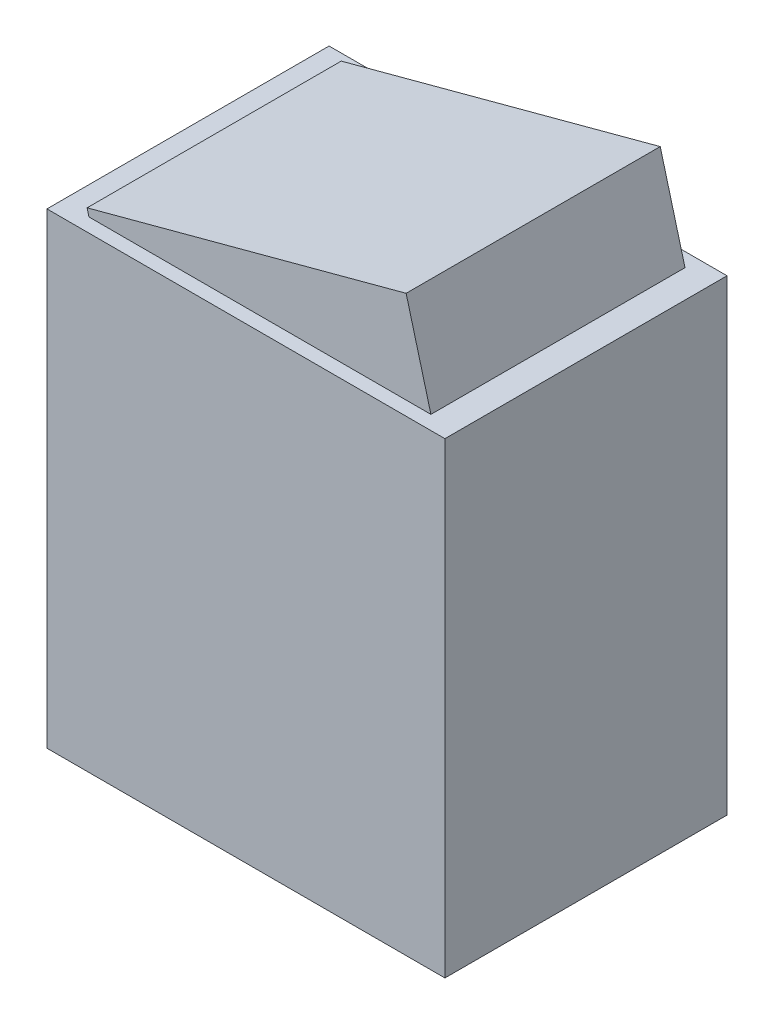
ISO-10303-21;
HEADER;
FILE_DESCRIPTION(('STEP AP214'),'2;1');
FILE_NAME('part.step','',(''),(''),'','','');
FILE_SCHEMA(('AUTOMOTIVE_DESIGN { 1 0 10303 214 1 1 1 1 }'));
ENDSEC;
DATA;
#1=APPLICATION_CONTEXT('core data for automotive mechanical design processes');
#2=APPLICATION_PROTOCOL_DEFINITION('international standard','automotive_design',2000,#1);
#3=PRODUCT_CONTEXT('',#1,'mechanical');
#4=PRODUCT('Part','Part','',(#3));
#5=PRODUCT_RELATED_PRODUCT_CATEGORY('part','',(#4));
#6=PRODUCT_DEFINITION_FORMATION('','',#4);
#7=PRODUCT_DEFINITION_CONTEXT('part definition',#1,'design');
#8=PRODUCT_DEFINITION('design','',#6,#7);
#9=PRODUCT_DEFINITION_SHAPE('','',#8);
#10=(LENGTH_UNIT() NAMED_UNIT(*) SI_UNIT(.MILLI.,.METRE.));
#11=(NAMED_UNIT(*) PLANE_ANGLE_UNIT() SI_UNIT($,.RADIAN.));
#12=(NAMED_UNIT(*) SI_UNIT($,.STERADIAN.) SOLID_ANGLE_UNIT());
#13=UNCERTAINTY_MEASURE_WITH_UNIT(LENGTH_MEASURE(1.E-05),#10,'distance_accuracy_value','');
#14=(GEOMETRIC_REPRESENTATION_CONTEXT(3) GLOBAL_UNCERTAINTY_ASSIGNED_CONTEXT((#13)) GLOBAL_UNIT_ASSIGNED_CONTEXT((#10,
#11,#12)) REPRESENTATION_CONTEXT('',''));
#15=CARTESIAN_POINT('',(0.,0.,0.));
#16=DIRECTION('',(0.,0.,1.));
#17=DIRECTION('',(1.,0.,0.));
#18=AXIS2_PLACEMENT_3D('',#15,#16,#17);
#19=CARTESIAN_POINT('',(0.,25.,0.));
#20=DIRECTION('',(0.,1.,0.));
#21=DIRECTION('',(0.,0.,1.));
#22=AXIS2_PLACEMENT_3D('',#19,#20,#21);
#23=PLANE('',#22);
#24=DIRECTION('',(0.,0.,-1.));
#25=VECTOR('',#24,1.);
#26=CARTESIAN_POINT('',(10.65,25.,-7.55));
#27=LINE('',#26,#25);
#28=CARTESIAN_POINT('',(10.65,25.,7.55));
#29=VERTEX_POINT('',#28);
#30=CARTESIAN_POINT('',(10.65,25.,-7.55));
#31=VERTEX_POINT('',#30);
#32=EDGE_CURVE('E143',#29,#31,#27,.T.);
#33=ORIENTED_EDGE('',*,*,#32,.T.);
#34=DIRECTION('',(-1.,0.,0.));
#35=VECTOR('',#34,1.);
#36=CARTESIAN_POINT('',(-10.65,25.,-7.55));
#37=LINE('',#36,#35);
#38=CARTESIAN_POINT('',(-10.65,25.,-7.55));
#39=VERTEX_POINT('',#38);
#40=EDGE_CURVE('E85',#31,#39,#37,.T.);
#41=ORIENTED_EDGE('',*,*,#40,.T.);
#42=DIRECTION('',(0.,0.,1.));
#43=VECTOR('',#42,1.);
#44=CARTESIAN_POINT('',(-10.65,25.,-7.55));
#45=LINE('',#44,#43);
#46=CARTESIAN_POINT('',(-10.65,25.,7.55));
#47=VERTEX_POINT('',#46);
#48=EDGE_CURVE('E146',#39,#47,#45,.T.);
#49=ORIENTED_EDGE('',*,*,#48,.T.);
#50=DIRECTION('',(1.,0.,0.));
#51=VECTOR('',#50,1.);
#52=CARTESIAN_POINT('',(-10.65,25.,7.55));
#53=LINE('',#52,#51);
#54=EDGE_CURVE('E57',#47,#29,#53,.T.);
#55=ORIENTED_EDGE('',*,*,#54,.T.);
#56=EDGE_LOOP('',(#33,#41,#49,#55));
#57=FACE_BOUND('',#56,.T.);
#58=DIRECTION('',(0.,0.,-1.));
#59=VECTOR('',#58,1.);
#60=CARTESIAN_POINT('',(-9.15,25.,-6.8));
#61=LINE('',#60,#59);
#62=CARTESIAN_POINT('',(-9.15,25.,6.8));
#63=VERTEX_POINT('',#62);
#64=CARTESIAN_POINT('',(-9.15,25.,-6.8));
#65=VERTEX_POINT('',#64);
#66=EDGE_CURVE('E140',#63,#65,#61,.T.);
#67=ORIENTED_EDGE('',*,*,#66,.T.);
#68=DIRECTION('',(1.,0.,0.));
#69=VECTOR('',#68,1.);
#70=CARTESIAN_POINT('',(14.4112797963425,25.,-6.8));
#71=LINE('',#70,#69);
#72=CARTESIAN_POINT('',(9.15,25.,-6.8));
#73=VERTEX_POINT('',#72);
#74=EDGE_CURVE('E113',#65,#73,#71,.T.);
#75=ORIENTED_EDGE('',*,*,#74,.T.);
#76=DIRECTION('',(0.,0.,1.));
#77=VECTOR('',#76,1.);
#78=CARTESIAN_POINT('',(9.15,25.,6.8));
#79=LINE('',#78,#77);
#80=CARTESIAN_POINT('',(9.15,25.,6.8));
#81=VERTEX_POINT('',#80);
#82=EDGE_CURVE('E266',#73,#81,#79,.T.);
#83=ORIENTED_EDGE('',*,*,#82,.T.);
#84=DIRECTION('',(-1.,0.,0.));
#85=VECTOR('',#84,1.);
#86=CARTESIAN_POINT('',(-2.66285264828507,25.,6.8));
#87=LINE('',#86,#85);
#88=EDGE_CURVE('E136',#81,#63,#87,.T.);
#89=ORIENTED_EDGE('',*,*,#88,.T.);
#90=EDGE_LOOP('',(#67,#75,#83,#89));
#91=FACE_BOUND('',#90,.T.);
#92=ADVANCED_FACE('F33',(#57,#91),#23,.T.);
#93=CARTESIAN_POINT('',(10.65,25.,-7.55));
#94=DIRECTION('',(-1.,0.,0.));
#95=DIRECTION('',(0.,0.,1.));
#96=AXIS2_PLACEMENT_3D('',#93,#94,#95);
#97=PLANE('',#96);
#98=DIRECTION('',(0.,0.,-1.));
#99=VECTOR('',#98,1.);
#100=CARTESIAN_POINT('',(10.65,0.,-7.55));
#101=LINE('',#100,#99);
#102=CARTESIAN_POINT('',(10.65,0.,7.55));
#103=VERTEX_POINT('',#102);
#104=CARTESIAN_POINT('',(10.65,0.,-7.55));
#105=VERTEX_POINT('',#104);
#106=EDGE_CURVE('E142',#103,#105,#101,.T.);
#107=ORIENTED_EDGE('',*,*,#106,.T.);
#108=DIRECTION('',(0.,-1.,0.));
#109=VECTOR('',#108,1.);
#110=CARTESIAN_POINT('',(10.65,25.,-7.55));
#111=LINE('',#110,#109);
#112=EDGE_CURVE('E11',#31,#105,#111,.T.);
#113=ORIENTED_EDGE('',*,*,#112,.F.);
#114=ORIENTED_EDGE('',*,*,#32,.F.);
#115=DIRECTION('',(0.,-1.,0.));
#116=VECTOR('',#115,1.);
#117=CARTESIAN_POINT('',(10.65,25.,7.55));
#118=LINE('',#117,#116);
#119=EDGE_CURVE('E149',#29,#103,#118,.T.);
#120=ORIENTED_EDGE('',*,*,#119,.T.);
#121=EDGE_LOOP('',(#107,#113,#114,#120));
#122=FACE_BOUND('',#121,.T.);
#123=ADVANCED_FACE('F35',(#122),#97,.F.);
#124=CARTESIAN_POINT('',(-10.65,25.,-7.55));
#125=DIRECTION('',(0.,0.,1.));
#126=DIRECTION('',(1.,0.,0.));
#127=AXIS2_PLACEMENT_3D('',#124,#125,#126);
#128=PLANE('',#127);
#129=DIRECTION('',(-1.,0.,0.));
#130=VECTOR('',#129,1.);
#131=CARTESIAN_POINT('',(-10.65,0.,-7.55));
#132=LINE('',#131,#130);
#133=CARTESIAN_POINT('',(-10.65,0.,-7.55));
#134=VERTEX_POINT('',#133);
#135=EDGE_CURVE('E152',#105,#134,#132,.T.);
#136=ORIENTED_EDGE('',*,*,#135,.T.);
#137=DIRECTION('',(0.,-1.,0.));
#138=VECTOR('',#137,1.);
#139=CARTESIAN_POINT('',(-10.65,25.,-7.55));
#140=LINE('',#139,#138);
#141=EDGE_CURVE('E41',#39,#134,#140,.T.);
#142=ORIENTED_EDGE('',*,*,#141,.F.);
#143=ORIENTED_EDGE('',*,*,#40,.F.);
#144=ORIENTED_EDGE('',*,*,#112,.T.);
#145=EDGE_LOOP('',(#136,#142,#143,#144));
#146=FACE_BOUND('',#145,.T.);
#147=ADVANCED_FACE('F179',(#146),#128,.F.);
#148=CARTESIAN_POINT('',(-10.65,25.,-7.55));
#149=DIRECTION('',(1.,0.,0.));
#150=DIRECTION('',(0.,0.,-1.));
#151=AXIS2_PLACEMENT_3D('',#148,#149,#150);
#152=PLANE('',#151);
#153=DIRECTION('',(0.,0.,1.));
#154=VECTOR('',#153,1.);
#155=CARTESIAN_POINT('',(-10.65,0.,-7.55));
#156=LINE('',#155,#154);
#157=CARTESIAN_POINT('',(-10.65,0.,7.55));
#158=VERTEX_POINT('',#157);
#159=EDGE_CURVE('E154',#134,#158,#156,.T.);
#160=ORIENTED_EDGE('',*,*,#159,.T.);
#161=DIRECTION('',(0.,-1.,0.));
#162=VECTOR('',#161,1.);
#163=CARTESIAN_POINT('',(-10.65,25.,7.55));
#164=LINE('',#163,#162);
#165=EDGE_CURVE('E158',#47,#158,#164,.T.);
#166=ORIENTED_EDGE('',*,*,#165,.F.);
#167=ORIENTED_EDGE('',*,*,#48,.F.);
#168=ORIENTED_EDGE('',*,*,#141,.T.);
#169=EDGE_LOOP('',(#160,#166,#167,#168));
#170=FACE_BOUND('',#169,.T.);
#171=ADVANCED_FACE('F163',(#170),#152,.F.);
#172=CARTESIAN_POINT('',(-10.65,25.,7.55));
#173=DIRECTION('',(0.,0.,-1.));
#174=DIRECTION('',(-1.,0.,0.));
#175=AXIS2_PLACEMENT_3D('',#172,#173,#174);
#176=PLANE('',#175);
#177=DIRECTION('',(1.,0.,0.));
#178=VECTOR('',#177,1.);
#179=CARTESIAN_POINT('',(-10.65,0.,7.55));
#180=LINE('',#179,#178);
#181=EDGE_CURVE('E78',#158,#103,#180,.T.);
#182=ORIENTED_EDGE('',*,*,#181,.T.);
#183=ORIENTED_EDGE('',*,*,#119,.F.);
#184=ORIENTED_EDGE('',*,*,#54,.F.);
#185=ORIENTED_EDGE('',*,*,#165,.T.);
#186=EDGE_LOOP('',(#182,#183,#184,#185));
#187=FACE_BOUND('',#186,.T.);
#188=ADVANCED_FACE('F171',(#187),#176,.F.);
#189=CARTESIAN_POINT('',(0.,0.,0.));
#190=DIRECTION('',(0.,1.,0.));
#191=DIRECTION('',(0.,0.,1.));
#192=AXIS2_PLACEMENT_3D('',#189,#190,#191);
#193=PLANE('',#192);
#194=ORIENTED_EDGE('',*,*,#106,.F.);
#195=ORIENTED_EDGE('',*,*,#181,.F.);
#196=ORIENTED_EDGE('',*,*,#159,.F.);
#197=ORIENTED_EDGE('',*,*,#135,.F.);
#198=EDGE_LOOP('',(#194,#195,#196,#197));
#199=FACE_BOUND('',#198,.T.);
#200=ADVANCED_FACE('F167',(#199),#193,.F.);
#201=CARTESIAN_POINT('',(14.4112797963425,5.36463648721444,-6.8));
#202=DIRECTION('',(0.,0.,-1.));
#203=DIRECTION('',(-1.,0.,0.));
#204=AXIS2_PLACEMENT_3D('',#201,#202,#203);
#205=PLANE('',#204);
#206=ORIENTED_EDGE('',*,*,#74,.F.);
#207=DIRECTION('',(-0.258819045102525,0.965925826289067,0.));
#208=VECTOR('',#207,1.);
#209=CARTESIAN_POINT('',(-2.66285264828507,0.78963648721438,-6.8));
#210=LINE('',#209,#208);
#211=CARTESIAN_POINT('',(-9.25048094716167,25.375,-6.8));
#212=VERTEX_POINT('',#211);
#213=EDGE_CURVE('E48',#65,#212,#210,.T.);
#214=ORIENTED_EDGE('',*,*,#213,.T.);
#215=DIRECTION('',(-0.965925826289067,-0.258819045102525,0.));
#216=VECTOR('',#215,1.);
#217=CARTESIAN_POINT('',(7.8236514974659,29.9500000000001,-6.8));
#218=LINE('',#217,#216);
#219=CARTESIAN_POINT('',(7.8236514974659,29.9500000000001,-6.8));
#220=VERTEX_POINT('',#219);
#221=EDGE_CURVE('E110',#220,#212,#218,.T.);
#222=ORIENTED_EDGE('',*,*,#221,.F.);
#223=DIRECTION('',(-0.258819045102525,0.965925826289067,0.));
#224=VECTOR('',#223,1.);
#225=CARTESIAN_POINT('',(14.4112797963425,5.36463648721444,-6.8));
#226=LINE('',#225,#224);
#227=EDGE_CURVE('E134',#73,#220,#226,.T.);
#228=ORIENTED_EDGE('',*,*,#227,.F.);
#229=EDGE_LOOP('',(#206,#214,#222,#228));
#230=FACE_BOUND('',#229,.T.);
#231=ADVANCED_FACE('F107',(#230),#205,.T.);
#232=CARTESIAN_POINT('',(14.4112797963425,5.36463648721444,6.8));
#233=DIRECTION('',(0.965925826289067,0.258819045102525,0.));
#234=DIRECTION('',(-0.258819045102525,0.965925826289067,0.));
#235=AXIS2_PLACEMENT_3D('',#232,#233,#234);
#236=PLANE('',#235);
#237=ORIENTED_EDGE('',*,*,#82,.F.);
#238=ORIENTED_EDGE('',*,*,#227,.T.);
#239=DIRECTION('',(0.,0.,-1.));
#240=VECTOR('',#239,1.);
#241=CARTESIAN_POINT('',(7.8236514974659,29.9500000000001,6.8));
#242=LINE('',#241,#240);
#243=CARTESIAN_POINT('',(7.8236514974659,29.9500000000001,6.8));
#244=VERTEX_POINT('',#243);
#245=EDGE_CURVE('E116',#244,#220,#242,.T.);
#246=ORIENTED_EDGE('',*,*,#245,.F.);
#247=DIRECTION('',(-0.258819045102525,0.965925826289067,0.));
#248=VECTOR('',#247,1.);
#249=CARTESIAN_POINT('',(14.4112797963425,5.36463648721444,6.8));
#250=LINE('',#249,#248);
#251=EDGE_CURVE('E137',#81,#244,#250,.T.);
#252=ORIENTED_EDGE('',*,*,#251,.F.);
#253=EDGE_LOOP('',(#237,#238,#246,#252));
#254=FACE_BOUND('',#253,.T.);
#255=ADVANCED_FACE('F190',(#254),#236,.T.);
#256=CARTESIAN_POINT('',(-2.66285264828507,0.78963648721438,6.8));
#257=DIRECTION('',(0.,0.,1.));
#258=DIRECTION('',(1.,0.,0.));
#259=AXIS2_PLACEMENT_3D('',#256,#257,#258);
#260=PLANE('',#259);
#261=ORIENTED_EDGE('',*,*,#88,.F.);
#262=ORIENTED_EDGE('',*,*,#251,.T.);
#263=DIRECTION('',(0.965925826289067,0.258819045102525,0.));
#264=VECTOR('',#263,1.);
#265=CARTESIAN_POINT('',(-9.25048094716167,25.375,6.8));
#266=LINE('',#265,#264);
#267=CARTESIAN_POINT('',(-9.25048094716167,25.375,6.8));
#268=VERTEX_POINT('',#267);
#269=EDGE_CURVE('E124',#268,#244,#266,.T.);
#270=ORIENTED_EDGE('',*,*,#269,.F.);
#271=DIRECTION('',(-0.258819045102525,0.965925826289067,0.));
#272=VECTOR('',#271,1.);
#273=CARTESIAN_POINT('',(-2.66285264828507,0.78963648721438,6.8));
#274=LINE('',#273,#272);
#275=EDGE_CURVE('E115',#63,#268,#274,.T.);
#276=ORIENTED_EDGE('',*,*,#275,.F.);
#277=EDGE_LOOP('',(#261,#262,#270,#276));
#278=FACE_BOUND('',#277,.T.);
#279=ADVANCED_FACE('F193',(#278),#260,.T.);
#280=CARTESIAN_POINT('',(-2.66285264828507,0.78963648721438,-6.8));
#281=DIRECTION('',(-0.965925826289067,-0.258819045102525,0.));
#282=DIRECTION('',(0.258819045102525,-0.965925826289067,0.));
#283=AXIS2_PLACEMENT_3D('',#280,#281,#282);
#284=PLANE('',#283);
#285=ORIENTED_EDGE('',*,*,#66,.F.);
#286=ORIENTED_EDGE('',*,*,#275,.T.);
#287=DIRECTION('',(0.,0.,1.));
#288=VECTOR('',#287,1.);
#289=CARTESIAN_POINT('',(-9.25048094716167,25.375,-6.8));
#290=LINE('',#289,#288);
#291=EDGE_CURVE('E119',#212,#268,#290,.T.);
#292=ORIENTED_EDGE('',*,*,#291,.F.);
#293=ORIENTED_EDGE('',*,*,#213,.F.);
#294=EDGE_LOOP('',(#285,#286,#292,#293));
#295=FACE_BOUND('',#294,.T.);
#296=ADVANCED_FACE('F120',(#295),#284,.T.);
#297=CARTESIAN_POINT('',(-6.96341472484797,25.9878175473055,0.));
#298=DIRECTION('',(-0.258819045102525,0.965925826289067,0.));
#299=DIRECTION('',(-0.965925826289067,-0.258819045102525,0.));
#300=AXIS2_PLACEMENT_3D('',#297,#298,#299);
#301=PLANE('',#300);
#302=ORIENTED_EDGE('',*,*,#221,.T.);
#303=ORIENTED_EDGE('',*,*,#291,.T.);
#304=ORIENTED_EDGE('',*,*,#269,.T.);
#305=ORIENTED_EDGE('',*,*,#245,.T.);
#306=EDGE_LOOP('',(#302,#303,#304,#305));
#307=FACE_BOUND('',#306,.T.);
#308=ADVANCED_FACE('F126',(#307),#301,.T.);
#309=CLOSED_SHELL('',(#92,#123,#147,#171,#188,#200,#231,#255,#279,#296,#308));
#310=MANIFOLD_SOLID_BREP('B2',#309);
#311=ADVANCED_BREP_SHAPE_REPRESENTATION('',(#18,#310),#14);
#312=SHAPE_DEFINITION_REPRESENTATION(#9,#311);
ENDSEC;
END-ISO-10303-21;
